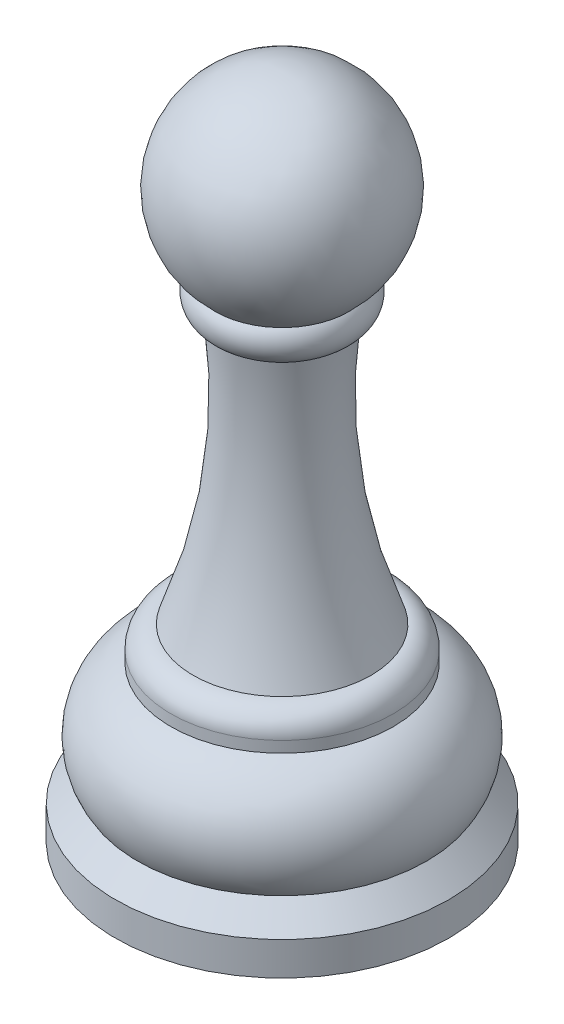
ISO-10303-21;
HEADER;
FILE_DESCRIPTION(('STEP AP214'),'2;1');
FILE_NAME('part.step','',(''),(''),'','','');
FILE_SCHEMA(('AUTOMOTIVE_DESIGN { 1 0 10303 214 1 1 1 1 }'));
ENDSEC;
DATA;
#1=APPLICATION_CONTEXT('core data for automotive mechanical design processes');
#2=APPLICATION_PROTOCOL_DEFINITION('international standard','automotive_design',2000,#1);
#3=PRODUCT_CONTEXT('',#1,'mechanical');
#4=PRODUCT('Part','Part','',(#3));
#5=PRODUCT_RELATED_PRODUCT_CATEGORY('part','',(#4));
#6=PRODUCT_DEFINITION_FORMATION('','',#4);
#7=PRODUCT_DEFINITION_CONTEXT('part definition',#1,'design');
#8=PRODUCT_DEFINITION('design','',#6,#7);
#9=PRODUCT_DEFINITION_SHAPE('','',#8);
#10=(LENGTH_UNIT() NAMED_UNIT(*) SI_UNIT(.MILLI.,.METRE.));
#11=(NAMED_UNIT(*) PLANE_ANGLE_UNIT() SI_UNIT($,.RADIAN.));
#12=(NAMED_UNIT(*) SI_UNIT($,.STERADIAN.) SOLID_ANGLE_UNIT());
#13=UNCERTAINTY_MEASURE_WITH_UNIT(LENGTH_MEASURE(1.E-05),#10,'distance_accuracy_value','');
#14=(GEOMETRIC_REPRESENTATION_CONTEXT(3) GLOBAL_UNCERTAINTY_ASSIGNED_CONTEXT((#13)) GLOBAL_UNIT_ASSIGNED_CONTEXT((#10,
#11,#12)) REPRESENTATION_CONTEXT('',''));
#15=CARTESIAN_POINT('',(0.,0.,0.));
#16=DIRECTION('',(0.,0.,1.));
#17=DIRECTION('',(1.,0.,0.));
#18=AXIS2_PLACEMENT_3D('',#15,#16,#17);
#19=CARTESIAN_POINT('',(0.,0.,0.));
#20=DIRECTION('',(0.,1.,0.));
#21=DIRECTION('',(-1.,0.,0.));
#22=AXIS2_PLACEMENT_3D('',#19,#20,#21);
#23=PLANE('',#22);
#24=CARTESIAN_POINT('',(0.,0.,0.));
#25=DIRECTION('',(0.,-1.,0.));
#26=DIRECTION('',(1.,0.,0.));
#27=AXIS2_PLACEMENT_3D('',#24,#25,#26);
#28=CIRCLE('',#27,15.);
#29=CARTESIAN_POINT('',(15.,1.02907469966573E-13,0.));
#30=VERTEX_POINT('',#29);
#31=EDGE_CURVE('E10',#30,#30,#28,.T.);
#32=ORIENTED_EDGE('',*,*,#31,.T.);
#33=EDGE_LOOP('',(#32));
#34=FACE_BOUND('',#33,.T.);
#35=ADVANCED_FACE('F34',(#34),#23,.F.);
#36=CARTESIAN_POINT('',(0.,0.,0.));
#37=DIRECTION('',(0.,-1.,0.));
#38=DIRECTION('',(1.,0.,0.));
#39=AXIS2_PLACEMENT_3D('',#36,#37,#38);
#40=CYLINDRICAL_SURFACE('',#39,15.);
#41=ORIENTED_EDGE('',*,*,#31,.F.);
#42=EDGE_LOOP('',(#41));
#43=FACE_BOUND('',#42,.T.);
#44=CARTESIAN_POINT('',(0.,3.00000000000005,0.));
#45=DIRECTION('',(0.,-1.,0.));
#46=DIRECTION('',(1.,0.,0.));
#47=AXIS2_PLACEMENT_3D('',#44,#45,#46);
#48=CIRCLE('',#47,15.);
#49=CARTESIAN_POINT('',(15.,3.0000000000001,0.));
#50=VERTEX_POINT('',#49);
#51=EDGE_CURVE('E40',#50,#50,#48,.T.);
#52=ORIENTED_EDGE('',*,*,#51,.T.);
#53=EDGE_LOOP('',(#52));
#54=FACE_BOUND('',#53,.T.);
#55=ADVANCED_FACE('F78',(#43,#54),#40,.T.);
#56=CARTESIAN_POINT('',(0.,5.00000000000004,0.));
#57=DIRECTION('',(0.,-1.,0.));
#58=DIRECTION('',(1.,0.,0.));
#59=AXIS2_PLACEMENT_3D('',#56,#57,#58);
#60=CONICAL_SURFACE('',#59,13.,0.785398163397457);
#61=ORIENTED_EDGE('',*,*,#51,.F.);
#62=EDGE_LOOP('',(#61));
#63=FACE_BOUND('',#62,.T.);
#64=CARTESIAN_POINT('',(0.,5.00000000000004,0.));
#65=DIRECTION('',(0.,-1.,0.));
#66=DIRECTION('',(1.,0.,0.));
#67=AXIS2_PLACEMENT_3D('',#64,#65,#66);
#68=CIRCLE('',#67,13.);
#69=CARTESIAN_POINT('',(12.9999999999999,5.00000000000009,0.));
#70=VERTEX_POINT('',#69);
#71=EDGE_CURVE('E44',#70,#70,#68,.T.);
#72=ORIENTED_EDGE('',*,*,#71,.T.);
#73=EDGE_LOOP('',(#72));
#74=FACE_BOUND('',#73,.T.);
#75=ADVANCED_FACE('F82',(#63,#74),#60,.T.);
#76=CARTESIAN_POINT('',(0.,8.31380661428571,0.));
#77=DIRECTION('',(0.,-1.,0.));
#78=DIRECTION('',(1.,0.,0.));
#79=AXIS2_PLACEMENT_3D('',#76,#77,#78);
#80=TOROIDAL_SURFACE('',#79,7.99813177671413,6.);
#81=ORIENTED_EDGE('',*,*,#71,.F.);
#82=EDGE_LOOP('',(#81));
#83=FACE_BOUND('',#82,.T.);
#84=CARTESIAN_POINT('',(0.,13.97,0.));
#85=DIRECTION('',(0.,-1.,0.));
#86=DIRECTION('',(1.,0.,0.));
#87=AXIS2_PLACEMENT_3D('',#84,#85,#86);
#88=CIRCLE('',#87,9.99999999999995);
#89=CARTESIAN_POINT('',(9.9999999999999,13.9700000000001,0.));
#90=VERTEX_POINT('',#89);
#91=EDGE_CURVE('E48',#90,#90,#88,.T.);
#92=ORIENTED_EDGE('',*,*,#91,.T.);
#93=EDGE_LOOP('',(#92));
#94=FACE_BOUND('',#93,.T.);
#95=ADVANCED_FACE('F87',(#83,#94),#80,.T.);
#96=CARTESIAN_POINT('',(0.,0.,0.));
#97=DIRECTION('',(0.,-1.,0.));
#98=DIRECTION('',(1.,0.,0.));
#99=AXIS2_PLACEMENT_3D('',#96,#97,#98);
#100=CYLINDRICAL_SURFACE('',#99,9.99999999999995);
#101=ORIENTED_EDGE('',*,*,#91,.F.);
#102=EDGE_LOOP('',(#101));
#103=FACE_BOUND('',#102,.T.);
#104=CARTESIAN_POINT('',(0.,14.97,0.));
#105=DIRECTION('',(0.,-1.,0.));
#106=DIRECTION('',(1.,0.,0.));
#107=AXIS2_PLACEMENT_3D('',#104,#105,#106);
#108=CIRCLE('',#107,9.99999999999995);
#109=CARTESIAN_POINT('',(9.9999999999999,14.9700000000001,0.));
#110=VERTEX_POINT('',#109);
#111=EDGE_CURVE('E53',#110,#110,#108,.T.);
#112=ORIENTED_EDGE('',*,*,#111,.T.);
#113=EDGE_LOOP('',(#112));
#114=FACE_BOUND('',#113,.T.);
#115=ADVANCED_FACE('F93',(#103,#114),#100,.T.);
#116=CARTESIAN_POINT('',(0.,14.97,0.));
#117=DIRECTION('',(0.,-1.,0.));
#118=DIRECTION('',(1.,0.,0.));
#119=AXIS2_PLACEMENT_3D('',#116,#117,#118);
#120=TOROIDAL_SURFACE('',#119,7.99999999999995,2.);
#121=ORIENTED_EDGE('',*,*,#111,.F.);
#122=EDGE_LOOP('',(#121));
#123=FACE_BOUND('',#122,.T.);
#124=CARTESIAN_POINT('',(0.,16.97,0.));
#125=DIRECTION('',(0.,-1.,0.));
#126=DIRECTION('',(1.,0.,0.));
#127=AXIS2_PLACEMENT_3D('',#124,#125,#126);
#128=CIRCLE('',#127,7.99999999999994);
#129=CARTESIAN_POINT('',(7.99999999999988,16.9700000000001,0.));
#130=VERTEX_POINT('',#129);
#131=EDGE_CURVE('E56',#130,#130,#128,.T.);
#132=ORIENTED_EDGE('',*,*,#131,.T.);
#133=EDGE_LOOP('',(#132));
#134=FACE_BOUND('',#133,.T.);
#135=ADVANCED_FACE('F97',(#123,#134),#120,.T.);
#136=CARTESIAN_POINT('',(-1.2490009027033E-13,35.0019065796666,0.));
#137=DIRECTION('',(0.,-1.,0.));
#138=DIRECTION('',(1.,0.,0.));
#139=AXIS2_PLACEMENT_3D('',#136,#137,#138);
#140=TOROIDAL_SURFACE('',#139,54.6352907689249,50.);
#141=ORIENTED_EDGE('',*,*,#131,.F.);
#142=EDGE_LOOP('',(#141));
#143=FACE_BOUND('',#142,.T.);
#144=CARTESIAN_POINT('',(-1.43255479332734E-13,41.03,0.));
#145=DIRECTION('',(0.,-1.,0.));
#146=DIRECTION('',(1.,0.,0.));
#147=AXIS2_PLACEMENT_3D('',#144,#145,#146);
#148=CIRCLE('',#147,4.99999999999985);
#149=CARTESIAN_POINT('',(4.99999999999971,41.03,0.));
#150=VERTEX_POINT('',#149);
#151=EDGE_CURVE('E59',#150,#150,#148,.T.);
#152=ORIENTED_EDGE('',*,*,#151,.T.);
#153=EDGE_LOOP('',(#152));
#154=FACE_BOUND('',#153,.T.);
#155=ADVANCED_FACE('F74',(#143,#154),#140,.F.);
#156=CARTESIAN_POINT('',(-1.50053580671994E-13,42.9666090048249,0.));
#157=DIRECTION('',(0.,-1.,0.));
#158=DIRECTION('',(1.,0.,0.));
#159=AXIS2_PLACEMENT_3D('',#156,#157,#158);
#160=TOROIDAL_SURFACE('',#159,4.50045464427031,2.);
#161=ORIENTED_EDGE('',*,*,#151,.F.);
#162=EDGE_LOOP('',(#161));
#163=FACE_BOUND('',#162,.T.);
#164=CARTESIAN_POINT('',(-1.54637708497362E-13,44.29,0.));
#165=DIRECTION('',(0.,-1.,0.));
#166=DIRECTION('',(1.,0.,0.));
#167=AXIS2_PLACEMENT_3D('',#164,#165,#166);
#168=CIRCLE('',#167,5.99999999999969);
#169=CARTESIAN_POINT('',(5.99999999999954,44.29,0.));
#170=VERTEX_POINT('',#169);
#171=EDGE_CURVE('E62',#170,#170,#168,.T.);
#172=ORIENTED_EDGE('',*,*,#171,.T.);
#173=EDGE_LOOP('',(#172));
#174=FACE_BOUND('',#173,.T.);
#175=ADVANCED_FACE('F66',(#163,#174),#160,.T.);
#176=CARTESIAN_POINT('',(0.,50.999232972629,0.));
#177=DIRECTION('',(0.,-1.,0.));
#178=DIRECTION('',(-1.,0.,0.));
#179=AXIS2_PLACEMENT_3D('',#176,#177,#178);
#180=SPHERICAL_SURFACE('',#179,9.00076702737104);
#181=ORIENTED_EDGE('',*,*,#171,.F.);
#182=EDGE_LOOP('',(#181));
#183=FACE_BOUND('',#182,.T.);
#184=ADVANCED_FACE('F68',(#183),#180,.T.);
#185=CLOSED_SHELL('',(#35,#55,#75,#95,#115,#135,#155,#175,#184));
#186=MANIFOLD_SOLID_BREP('B2',#185);
#187=ADVANCED_BREP_SHAPE_REPRESENTATION('',(#18,#186),#14);
#188=SHAPE_DEFINITION_REPRESENTATION(#9,#187);
ENDSEC;
END-ISO-10303-21;
